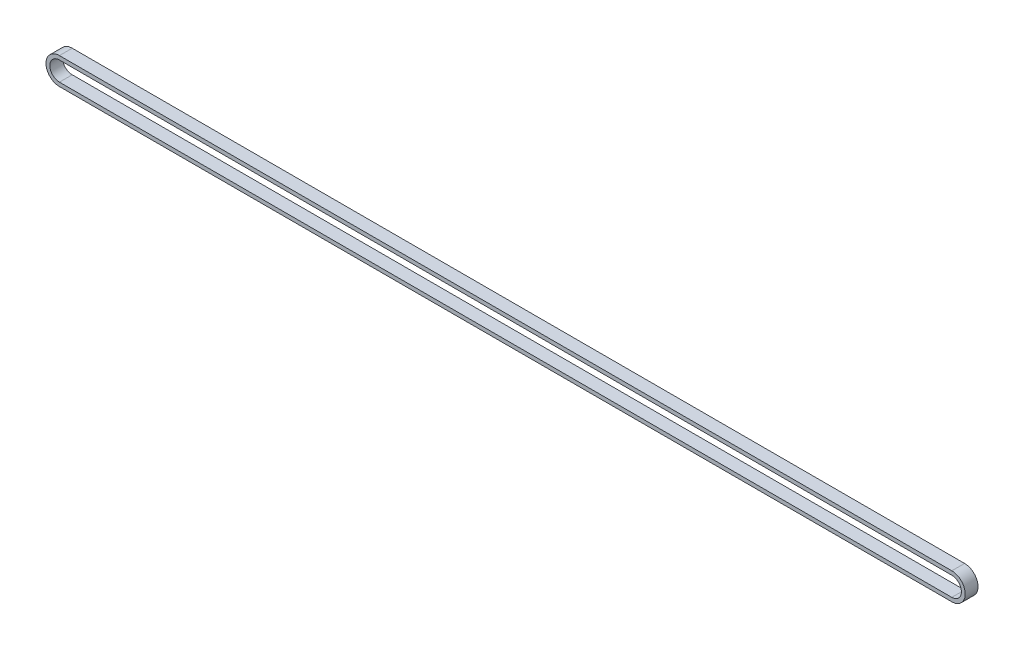
ISO-10303-21;
HEADER;
FILE_DESCRIPTION(('STEP AP214'),'2;1');
FILE_NAME('part.step','',(''),(''),'','','');
FILE_SCHEMA(('AUTOMOTIVE_DESIGN { 1 0 10303 214 1 1 1 1 }'));
ENDSEC;
DATA;
#1=APPLICATION_CONTEXT('core data for automotive mechanical design processes');
#2=APPLICATION_PROTOCOL_DEFINITION('international standard','automotive_design',2000,#1);
#3=PRODUCT_CONTEXT('',#1,'mechanical');
#4=PRODUCT('Part','Part','',(#3));
#5=PRODUCT_RELATED_PRODUCT_CATEGORY('part','',(#4));
#6=PRODUCT_DEFINITION_FORMATION('','',#4);
#7=PRODUCT_DEFINITION_CONTEXT('part definition',#1,'design');
#8=PRODUCT_DEFINITION('design','',#6,#7);
#9=PRODUCT_DEFINITION_SHAPE('','',#8);
#10=(LENGTH_UNIT() NAMED_UNIT(*) SI_UNIT(.MILLI.,.METRE.));
#11=(NAMED_UNIT(*) PLANE_ANGLE_UNIT() SI_UNIT($,.RADIAN.));
#12=(NAMED_UNIT(*) SI_UNIT($,.STERADIAN.) SOLID_ANGLE_UNIT());
#13=UNCERTAINTY_MEASURE_WITH_UNIT(LENGTH_MEASURE(1.E-05),#10,'distance_accuracy_value','');
#14=(GEOMETRIC_REPRESENTATION_CONTEXT(3) GLOBAL_UNCERTAINTY_ASSIGNED_CONTEXT((#13)) GLOBAL_UNIT_ASSIGNED_CONTEXT((#10,
#11,#12)) REPRESENTATION_CONTEXT('',''));
#15=CARTESIAN_POINT('',(0.,0.,0.));
#16=DIRECTION('',(0.,0.,1.));
#17=DIRECTION('',(1.,0.,0.));
#18=AXIS2_PLACEMENT_3D('',#15,#16,#17);
#19=CARTESIAN_POINT('',(-209.395,0.,6.));
#20=DIRECTION('',(0.,0.,1.));
#21=DIRECTION('',(1.,0.,0.));
#22=AXIS2_PLACEMENT_3D('',#19,#20,#21);
#23=PLANE('',#22);
#24=CARTESIAN_POINT('',(-209.395,0.,6.));
#25=DIRECTION('',(0.,0.,1.));
#26=DIRECTION('',(1.,0.,0.));
#27=AXIS2_PLACEMENT_3D('',#24,#25,#26);
#28=CIRCLE('',#27,6.3);
#29=CARTESIAN_POINT('',(-209.395,6.3,6.));
#30=VERTEX_POINT('',#29);
#31=CARTESIAN_POINT('',(-209.395,-6.3,6.));
#32=VERTEX_POINT('',#31);
#33=EDGE_CURVE('E179',#30,#32,#28,.T.);
#34=ORIENTED_EDGE('',*,*,#33,.T.);
#35=DIRECTION('',(1.,0.,0.));
#36=VECTOR('',#35,1.);
#37=CARTESIAN_POINT('',(-209.395,-6.3,6.));
#38=LINE('',#37,#36);
#39=CARTESIAN_POINT('',(209.395,-6.29999999999992,6.));
#40=VERTEX_POINT('',#39);
#41=EDGE_CURVE('E183',#32,#40,#38,.T.);
#42=ORIENTED_EDGE('',*,*,#41,.T.);
#43=CARTESIAN_POINT('',(209.395,0.,6.));
#44=DIRECTION('',(0.,0.,1.));
#45=DIRECTION('',(1.,0.,0.));
#46=AXIS2_PLACEMENT_3D('',#43,#44,#45);
#47=CIRCLE('',#46,6.3);
#48=CARTESIAN_POINT('',(209.395,6.30000000000008,6.));
#49=VERTEX_POINT('',#48);
#50=EDGE_CURVE('E187',#40,#49,#47,.T.);
#51=ORIENTED_EDGE('',*,*,#50,.T.);
#52=DIRECTION('',(-1.,0.,0.));
#53=VECTOR('',#52,1.);
#54=CARTESIAN_POINT('',(-209.395,6.3,6.));
#55=LINE('',#54,#53);
#56=EDGE_CURVE('E190',#49,#30,#55,.T.);
#57=ORIENTED_EDGE('',*,*,#56,.T.);
#58=EDGE_LOOP('',(#34,#42,#51,#57));
#59=FACE_BOUND('',#58,.T.);
#60=DIRECTION('',(1.,0.,0.));
#61=VECTOR('',#60,1.);
#62=CARTESIAN_POINT('',(-209.395,-4.5,6.));
#63=LINE('',#62,#61);
#64=CARTESIAN_POINT('',(-209.395,-4.5,6.));
#65=VERTEX_POINT('',#64);
#66=CARTESIAN_POINT('',(209.395,-4.49999999999993,6.));
#67=VERTEX_POINT('',#66);
#68=EDGE_CURVE('E140',#65,#67,#63,.T.);
#69=ORIENTED_EDGE('',*,*,#68,.F.);
#70=CARTESIAN_POINT('',(-209.395,0.,6.));
#71=DIRECTION('',(0.,0.,1.));
#72=DIRECTION('',(1.,0.,0.));
#73=AXIS2_PLACEMENT_3D('',#70,#71,#72);
#74=CIRCLE('',#73,4.5);
#75=CARTESIAN_POINT('',(-209.395,4.5,6.));
#76=VERTEX_POINT('',#75);
#77=EDGE_CURVE('E131',#76,#65,#74,.T.);
#78=ORIENTED_EDGE('',*,*,#77,.F.);
#79=DIRECTION('',(-1.,0.,0.));
#80=VECTOR('',#79,1.);
#81=CARTESIAN_POINT('',(-209.395,4.5,6.));
#82=LINE('',#81,#80);
#83=CARTESIAN_POINT('',(209.395,4.50000000000009,6.));
#84=VERTEX_POINT('',#83);
#85=EDGE_CURVE('E157',#84,#76,#82,.T.);
#86=ORIENTED_EDGE('',*,*,#85,.F.);
#87=CARTESIAN_POINT('',(209.395,0.,6.));
#88=DIRECTION('',(0.,0.,1.));
#89=DIRECTION('',(1.,0.,0.));
#90=AXIS2_PLACEMENT_3D('',#87,#88,#89);
#91=CIRCLE('',#90,4.5);
#92=EDGE_CURVE('E153',#67,#84,#91,.T.);
#93=ORIENTED_EDGE('',*,*,#92,.F.);
#94=EDGE_LOOP('',(#69,#78,#86,#93));
#95=FACE_BOUND('',#94,.T.);
#96=ADVANCED_FACE('F65',(#59,#95),#23,.T.);
#97=CARTESIAN_POINT('',(-209.395,0.,0.));
#98=DIRECTION('',(0.,0.,1.));
#99=DIRECTION('',(1.,0.,0.));
#100=AXIS2_PLACEMENT_3D('',#97,#98,#99);
#101=PLANE('',#100);
#102=CARTESIAN_POINT('',(-209.395,0.,0.));
#103=DIRECTION('',(0.,0.,1.));
#104=DIRECTION('',(1.,0.,0.));
#105=AXIS2_PLACEMENT_3D('',#102,#103,#104);
#106=CIRCLE('',#105,6.3);
#107=CARTESIAN_POINT('',(-209.395,6.3,0.));
#108=VERTEX_POINT('',#107);
#109=CARTESIAN_POINT('',(-209.395,-6.3,0.));
#110=VERTEX_POINT('',#109);
#111=EDGE_CURVE('E149',#108,#110,#106,.T.);
#112=ORIENTED_EDGE('',*,*,#111,.F.);
#113=DIRECTION('',(-1.,0.,0.));
#114=VECTOR('',#113,1.);
#115=CARTESIAN_POINT('',(-209.395,6.3,0.));
#116=LINE('',#115,#114);
#117=CARTESIAN_POINT('',(209.395,6.30000000000008,0.));
#118=VERTEX_POINT('',#117);
#119=EDGE_CURVE('E184',#118,#108,#116,.T.);
#120=ORIENTED_EDGE('',*,*,#119,.F.);
#121=CARTESIAN_POINT('',(209.395,0.,0.));
#122=DIRECTION('',(0.,0.,1.));
#123=DIRECTION('',(1.,0.,0.));
#124=AXIS2_PLACEMENT_3D('',#121,#122,#123);
#125=CIRCLE('',#124,6.3);
#126=CARTESIAN_POINT('',(209.395,-6.29999999999992,0.));
#127=VERTEX_POINT('',#126);
#128=EDGE_CURVE('E200',#127,#118,#125,.T.);
#129=ORIENTED_EDGE('',*,*,#128,.F.);
#130=DIRECTION('',(1.,0.,0.));
#131=VECTOR('',#130,1.);
#132=CARTESIAN_POINT('',(-209.395,-6.3,0.));
#133=LINE('',#132,#131);
#134=EDGE_CURVE('E197',#110,#127,#133,.T.);
#135=ORIENTED_EDGE('',*,*,#134,.F.);
#136=EDGE_LOOP('',(#112,#120,#129,#135));
#137=FACE_BOUND('',#136,.T.);
#138=CARTESIAN_POINT('',(-209.395,0.,0.));
#139=DIRECTION('',(0.,0.,1.));
#140=DIRECTION('',(1.,0.,0.));
#141=AXIS2_PLACEMENT_3D('',#138,#139,#140);
#142=CIRCLE('',#141,4.5);
#143=CARTESIAN_POINT('',(-209.395,4.5,0.));
#144=VERTEX_POINT('',#143);
#145=CARTESIAN_POINT('',(-209.395,-4.5,0.));
#146=VERTEX_POINT('',#145);
#147=EDGE_CURVE('E89',#144,#146,#142,.T.);
#148=ORIENTED_EDGE('',*,*,#147,.T.);
#149=DIRECTION('',(1.,0.,0.));
#150=VECTOR('',#149,1.);
#151=CARTESIAN_POINT('',(-209.395,-4.5,0.));
#152=LINE('',#151,#150);
#153=CARTESIAN_POINT('',(209.395,-4.49999999999993,0.));
#154=VERTEX_POINT('',#153);
#155=EDGE_CURVE('E147',#146,#154,#152,.T.);
#156=ORIENTED_EDGE('',*,*,#155,.T.);
#157=CARTESIAN_POINT('',(209.395,0.,0.));
#158=DIRECTION('',(0.,0.,1.));
#159=DIRECTION('',(1.,0.,0.));
#160=AXIS2_PLACEMENT_3D('',#157,#158,#159);
#161=CIRCLE('',#160,4.5);
#162=CARTESIAN_POINT('',(209.395,4.50000000000009,0.));
#163=VERTEX_POINT('',#162);
#164=EDGE_CURVE('E166',#154,#163,#161,.T.);
#165=ORIENTED_EDGE('',*,*,#164,.T.);
#166=DIRECTION('',(-1.,0.,0.));
#167=VECTOR('',#166,1.);
#168=CARTESIAN_POINT('',(-209.395,4.5,0.));
#169=LINE('',#168,#167);
#170=EDGE_CURVE('E141',#163,#144,#169,.T.);
#171=ORIENTED_EDGE('',*,*,#170,.T.);
#172=EDGE_LOOP('',(#148,#156,#165,#171));
#173=FACE_BOUND('',#172,.T.);
#174=ADVANCED_FACE('F223',(#137,#173),#101,.F.);
#175=CARTESIAN_POINT('',(-209.395,0.,6.));
#176=DIRECTION('',(0.,0.,-1.));
#177=DIRECTION('',(-1.,0.,0.));
#178=AXIS2_PLACEMENT_3D('',#175,#176,#177);
#179=CYLINDRICAL_SURFACE('',#178,6.3);
#180=ORIENTED_EDGE('',*,*,#111,.T.);
#181=DIRECTION('',(0.,0.,-1.));
#182=VECTOR('',#181,1.);
#183=CARTESIAN_POINT('',(-209.395,-6.3,6.));
#184=LINE('',#183,#182);
#185=EDGE_CURVE('E12',#32,#110,#184,.T.);
#186=ORIENTED_EDGE('',*,*,#185,.F.);
#187=ORIENTED_EDGE('',*,*,#33,.F.);
#188=DIRECTION('',(0.,0.,-1.));
#189=VECTOR('',#188,1.);
#190=CARTESIAN_POINT('',(-209.395,6.3,6.));
#191=LINE('',#190,#189);
#192=EDGE_CURVE('E193',#30,#108,#191,.T.);
#193=ORIENTED_EDGE('',*,*,#192,.T.);
#194=EDGE_LOOP('',(#180,#186,#187,#193));
#195=FACE_BOUND('',#194,.T.);
#196=ADVANCED_FACE('F67',(#195),#179,.T.);
#197=CARTESIAN_POINT('',(-209.395,-6.3,6.));
#198=DIRECTION('',(0.,1.,0.));
#199=DIRECTION('',(-1.,0.,0.));
#200=AXIS2_PLACEMENT_3D('',#197,#198,#199);
#201=PLANE('',#200);
#202=ORIENTED_EDGE('',*,*,#134,.T.);
#203=DIRECTION('',(0.,0.,-1.));
#204=VECTOR('',#203,1.);
#205=CARTESIAN_POINT('',(209.395,-6.29999999999992,6.));
#206=LINE('',#205,#204);
#207=EDGE_CURVE('E74',#40,#127,#206,.T.);
#208=ORIENTED_EDGE('',*,*,#207,.F.);
#209=ORIENTED_EDGE('',*,*,#41,.F.);
#210=ORIENTED_EDGE('',*,*,#185,.T.);
#211=EDGE_LOOP('',(#202,#208,#209,#210));
#212=FACE_BOUND('',#211,.T.);
#213=ADVANCED_FACE('F233',(#212),#201,.F.);
#214=CARTESIAN_POINT('',(209.395,0.,6.));
#215=DIRECTION('',(0.,0.,-1.));
#216=DIRECTION('',(-1.,0.,0.));
#217=AXIS2_PLACEMENT_3D('',#214,#215,#216);
#218=CYLINDRICAL_SURFACE('',#217,6.3);
#219=ORIENTED_EDGE('',*,*,#128,.T.);
#220=DIRECTION('',(0.,0.,-1.));
#221=VECTOR('',#220,1.);
#222=CARTESIAN_POINT('',(209.395,6.30000000000008,6.));
#223=LINE('',#222,#221);
#224=EDGE_CURVE('E208',#49,#118,#223,.T.);
#225=ORIENTED_EDGE('',*,*,#224,.F.);
#226=ORIENTED_EDGE('',*,*,#50,.F.);
#227=ORIENTED_EDGE('',*,*,#207,.T.);
#228=EDGE_LOOP('',(#219,#225,#226,#227));
#229=FACE_BOUND('',#228,.T.);
#230=ADVANCED_FACE('F217',(#229),#218,.T.);
#231=CARTESIAN_POINT('',(-209.395,6.3,6.));
#232=DIRECTION('',(0.,-1.,0.));
#233=DIRECTION('',(1.,0.,0.));
#234=AXIS2_PLACEMENT_3D('',#231,#232,#233);
#235=PLANE('',#234);
#236=ORIENTED_EDGE('',*,*,#119,.T.);
#237=ORIENTED_EDGE('',*,*,#192,.F.);
#238=ORIENTED_EDGE('',*,*,#56,.F.);
#239=ORIENTED_EDGE('',*,*,#224,.T.);
#240=EDGE_LOOP('',(#236,#237,#238,#239));
#241=FACE_BOUND('',#240,.T.);
#242=ADVANCED_FACE('F227',(#241),#235,.F.);
#243=CARTESIAN_POINT('',(-209.395,0.,6.));
#244=DIRECTION('',(0.,0.,-1.));
#245=DIRECTION('',(-1.,0.,0.));
#246=AXIS2_PLACEMENT_3D('',#243,#244,#245);
#247=CYLINDRICAL_SURFACE('',#246,4.5);
#248=ORIENTED_EDGE('',*,*,#147,.F.);
#249=DIRECTION('',(0.,0.,-1.));
#250=VECTOR('',#249,1.);
#251=CARTESIAN_POINT('',(-209.395,4.5,6.));
#252=LINE('',#251,#250);
#253=EDGE_CURVE('E135',#76,#144,#252,.T.);
#254=ORIENTED_EDGE('',*,*,#253,.F.);
#255=ORIENTED_EDGE('',*,*,#77,.T.);
#256=DIRECTION('',(0.,0.,-1.));
#257=VECTOR('',#256,1.);
#258=CARTESIAN_POINT('',(-209.395,-4.5,6.));
#259=LINE('',#258,#257);
#260=EDGE_CURVE('E134',#65,#146,#259,.T.);
#261=ORIENTED_EDGE('',*,*,#260,.T.);
#262=EDGE_LOOP('',(#248,#254,#255,#261));
#263=FACE_BOUND('',#262,.T.);
#264=ADVANCED_FACE('F133',(#263),#247,.F.);
#265=CARTESIAN_POINT('',(-209.395,-4.5,6.));
#266=DIRECTION('',(0.,1.,0.));
#267=DIRECTION('',(-1.,0.,0.));
#268=AXIS2_PLACEMENT_3D('',#265,#266,#267);
#269=PLANE('',#268);
#270=ORIENTED_EDGE('',*,*,#155,.F.);
#271=ORIENTED_EDGE('',*,*,#260,.F.);
#272=ORIENTED_EDGE('',*,*,#68,.T.);
#273=DIRECTION('',(0.,0.,-1.));
#274=VECTOR('',#273,1.);
#275=CARTESIAN_POINT('',(209.395,-4.49999999999993,6.));
#276=LINE('',#275,#274);
#277=EDGE_CURVE('E150',#67,#154,#276,.T.);
#278=ORIENTED_EDGE('',*,*,#277,.T.);
#279=EDGE_LOOP('',(#270,#271,#272,#278));
#280=FACE_BOUND('',#279,.T.);
#281=ADVANCED_FACE('F144',(#280),#269,.T.);
#282=CARTESIAN_POINT('',(209.395,0.,6.));
#283=DIRECTION('',(0.,0.,-1.));
#284=DIRECTION('',(-1.,0.,0.));
#285=AXIS2_PLACEMENT_3D('',#282,#283,#284);
#286=CYLINDRICAL_SURFACE('',#285,4.5);
#287=ORIENTED_EDGE('',*,*,#164,.F.);
#288=ORIENTED_EDGE('',*,*,#277,.F.);
#289=ORIENTED_EDGE('',*,*,#92,.T.);
#290=DIRECTION('',(0.,0.,-1.));
#291=VECTOR('',#290,1.);
#292=CARTESIAN_POINT('',(209.395,4.50000000000009,6.));
#293=LINE('',#292,#291);
#294=EDGE_CURVE('E81',#84,#163,#293,.T.);
#295=ORIENTED_EDGE('',*,*,#294,.T.);
#296=EDGE_LOOP('',(#287,#288,#289,#295));
#297=FACE_BOUND('',#296,.T.);
#298=ADVANCED_FACE('F256',(#297),#286,.F.);
#299=CARTESIAN_POINT('',(-209.395,4.5,6.));
#300=DIRECTION('',(0.,-1.,0.));
#301=DIRECTION('',(1.,0.,0.));
#302=AXIS2_PLACEMENT_3D('',#299,#300,#301);
#303=PLANE('',#302);
#304=ORIENTED_EDGE('',*,*,#170,.F.);
#305=ORIENTED_EDGE('',*,*,#294,.F.);
#306=ORIENTED_EDGE('',*,*,#85,.T.);
#307=ORIENTED_EDGE('',*,*,#253,.T.);
#308=EDGE_LOOP('',(#304,#305,#306,#307));
#309=FACE_BOUND('',#308,.T.);
#310=ADVANCED_FACE('F260',(#309),#303,.T.);
#311=CLOSED_SHELL('',(#96,#174,#196,#213,#230,#242,#264,#281,#298,#310));
#312=MANIFOLD_SOLID_BREP('B2',#311);
#313=ADVANCED_BREP_SHAPE_REPRESENTATION('',(#18,#312),#14);
#314=SHAPE_DEFINITION_REPRESENTATION(#9,#313);
ENDSEC;
END-ISO-10303-21;
